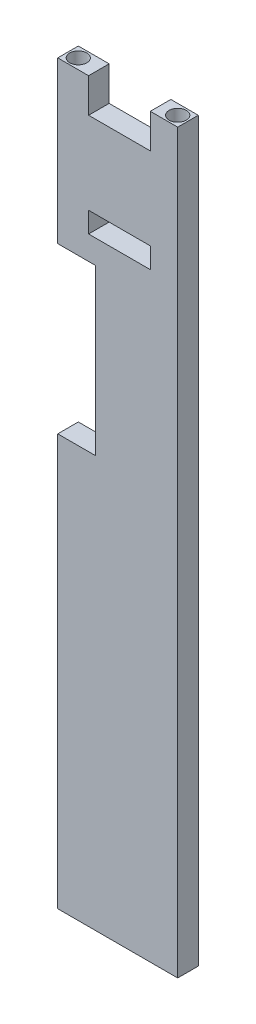
ISO-10303-21;
HEADER;
FILE_DESCRIPTION(('STEP AP214'),'2;1');
FILE_NAME('part.step','',(''),(''),'','','');
FILE_SCHEMA(('AUTOMOTIVE_DESIGN { 1 0 10303 214 1 1 1 1 }'));
ENDSEC;
DATA;
#1=APPLICATION_CONTEXT('core data for automotive mechanical design processes');
#2=APPLICATION_PROTOCOL_DEFINITION('international standard','automotive_design',2000,#1);
#3=PRODUCT_CONTEXT('',#1,'mechanical');
#4=PRODUCT('Part','Part','',(#3));
#5=PRODUCT_RELATED_PRODUCT_CATEGORY('part','',(#4));
#6=PRODUCT_DEFINITION_FORMATION('','',#4);
#7=PRODUCT_DEFINITION_CONTEXT('part definition',#1,'design');
#8=PRODUCT_DEFINITION('design','',#6,#7);
#9=PRODUCT_DEFINITION_SHAPE('','',#8);
#10=(LENGTH_UNIT() NAMED_UNIT(*) SI_UNIT(.MILLI.,.METRE.));
#11=(NAMED_UNIT(*) PLANE_ANGLE_UNIT() SI_UNIT($,.RADIAN.));
#12=(NAMED_UNIT(*) SI_UNIT($,.STERADIAN.) SOLID_ANGLE_UNIT());
#13=UNCERTAINTY_MEASURE_WITH_UNIT(LENGTH_MEASURE(1.E-05),#10,'distance_accuracy_value','');
#14=(GEOMETRIC_REPRESENTATION_CONTEXT(3) GLOBAL_UNCERTAINTY_ASSIGNED_CONTEXT((#13)) GLOBAL_UNIT_ASSIGNED_CONTEXT((#10,
#11,#12)) REPRESENTATION_CONTEXT('',''));
#15=CARTESIAN_POINT('',(0.,0.,0.));
#16=DIRECTION('',(0.,0.,1.));
#17=DIRECTION('',(1.,0.,0.));
#18=AXIS2_PLACEMENT_3D('',#15,#16,#17);
#19=CARTESIAN_POINT('',(0.,0.,6.));
#20=DIRECTION('',(1.,0.,0.));
#21=DIRECTION('',(0.,0.,-1.));
#22=AXIS2_PLACEMENT_3D('',#19,#20,#21);
#23=PLANE('',#22);
#24=DIRECTION('',(0.,-1.,0.));
#25=VECTOR('',#24,1.);
#26=CARTESIAN_POINT('',(0.,0.,6.));
#27=LINE('',#26,#25);
#28=CARTESIAN_POINT('',(5.90026326086193E-13,120.000003764364,6.));
#29=VERTEX_POINT('',#28);
#30=CARTESIAN_POINT('',(0.,0.,6.));
#31=VERTEX_POINT('',#30);
#32=EDGE_CURVE('E172',#29,#31,#27,.T.);
#33=ORIENTED_EDGE('',*,*,#32,.F.);
#34=DIRECTION('',(0.,0.,-1.));
#35=VECTOR('',#34,1.);
#36=CARTESIAN_POINT('',(5.90026326086193E-13,120.000003764364,6.));
#37=LINE('',#36,#35);
#38=CARTESIAN_POINT('',(5.90026326086193E-13,120.000003764364,0.));
#39=VERTEX_POINT('',#38);
#40=EDGE_CURVE('E232',#29,#39,#37,.T.);
#41=ORIENTED_EDGE('',*,*,#40,.T.);
#42=DIRECTION('',(0.,-1.,0.));
#43=VECTOR('',#42,1.);
#44=CARTESIAN_POINT('',(0.,0.,0.));
#45=LINE('',#44,#43);
#46=CARTESIAN_POINT('',(0.,0.,0.));
#47=VERTEX_POINT('',#46);
#48=EDGE_CURVE('E188',#39,#47,#45,.T.);
#49=ORIENTED_EDGE('',*,*,#48,.T.);
#50=DIRECTION('',(0.,0.,-1.));
#51=VECTOR('',#50,1.);
#52=CARTESIAN_POINT('',(0.,0.,6.));
#53=LINE('',#52,#51);
#54=EDGE_CURVE('E11',#31,#47,#53,.T.);
#55=ORIENTED_EDGE('',*,*,#54,.F.);
#56=EDGE_LOOP('',(#33,#41,#49,#55));
#57=FACE_BOUND('',#56,.T.);
#58=ADVANCED_FACE('F35',(#57),#23,.F.);
#59=CARTESIAN_POINT('',(0.,215.,6.));
#60=DIRECTION('',(0.,-1.,0.));
#61=DIRECTION('',(0.,0.,-1.));
#62=AXIS2_PLACEMENT_3D('',#59,#60,#61);
#63=PLANE('',#62);
#64=CARTESIAN_POINT('',(3.,215.,3.));
#65=DIRECTION('',(0.,1.,0.));
#66=DIRECTION('',(0.,0.,1.));
#67=AXIS2_PLACEMENT_3D('',#64,#65,#66);
#68=CIRCLE('',#67,2.5);
#69=CARTESIAN_POINT('',(3.,215.,5.5));
#70=VERTEX_POINT('',#69);
#71=EDGE_CURVE('E338',#70,#70,#68,.T.);
#72=ORIENTED_EDGE('',*,*,#71,.F.);
#73=EDGE_LOOP('',(#72));
#74=FACE_BOUND('',#73,.T.);
#75=DIRECTION('',(-1.,0.,0.));
#76=VECTOR('',#75,1.);
#77=CARTESIAN_POINT('',(0.,215.,6.));
#78=LINE('',#77,#76);
#79=CARTESIAN_POINT('',(9.,215.,6.));
#80=VERTEX_POINT('',#79);
#81=CARTESIAN_POINT('',(0.,215.,6.));
#82=VERTEX_POINT('',#81);
#83=EDGE_CURVE('E169',#80,#82,#78,.T.);
#84=ORIENTED_EDGE('',*,*,#83,.F.);
#85=DIRECTION('',(0.,0.,1.));
#86=VECTOR('',#85,1.);
#87=CARTESIAN_POINT('',(9.,215.,0.));
#88=LINE('',#87,#86);
#89=CARTESIAN_POINT('',(9.,215.,0.));
#90=VERTEX_POINT('',#89);
#91=EDGE_CURVE('E251',#90,#80,#88,.T.);
#92=ORIENTED_EDGE('',*,*,#91,.F.);
#93=DIRECTION('',(-1.,0.,0.));
#94=VECTOR('',#93,1.);
#95=CARTESIAN_POINT('',(0.,215.,0.));
#96=LINE('',#95,#94);
#97=CARTESIAN_POINT('',(0.,215.,0.));
#98=VERTEX_POINT('',#97);
#99=EDGE_CURVE('E192',#90,#98,#96,.T.);
#100=ORIENTED_EDGE('',*,*,#99,.T.);
#101=DIRECTION('',(0.,0.,-1.));
#102=VECTOR('',#101,1.);
#103=CARTESIAN_POINT('',(0.,215.,6.));
#104=LINE('',#103,#102);
#105=EDGE_CURVE('E185',#82,#98,#104,.T.);
#106=ORIENTED_EDGE('',*,*,#105,.F.);
#107=EDGE_LOOP('',(#84,#92,#100,#106));
#108=FACE_BOUND('',#107,.T.);
#109=ADVANCED_FACE('F282',(#74,#108),#63,.F.);
#110=CARTESIAN_POINT('',(0.,168.054649654043,0.));
#111=VERTEX_POINT('',#110);
#112=EDGE_CURVE('E163',#98,#111,#45,.T.);
#113=ORIENTED_EDGE('',*,*,#112,.T.);
#114=DIRECTION('',(0.,0.,-1.));
#115=VECTOR('',#114,1.);
#116=CARTESIAN_POINT('',(7.57808225454722E-13,168.054649654043,6.));
#117=LINE('',#116,#115);
#118=CARTESIAN_POINT('',(7.57808225454722E-13,168.054649654043,6.));
#119=VERTEX_POINT('',#118);
#120=EDGE_CURVE('E50',#119,#111,#117,.T.);
#121=ORIENTED_EDGE('',*,*,#120,.F.);
#122=EDGE_CURVE('E161',#82,#119,#27,.T.);
#123=ORIENTED_EDGE('',*,*,#122,.F.);
#124=ORIENTED_EDGE('',*,*,#105,.T.);
#125=EDGE_LOOP('',(#113,#121,#123,#124));
#126=FACE_BOUND('',#125,.T.);
#127=ADVANCED_FACE('F37',(#126),#23,.F.);
#128=CARTESIAN_POINT('',(0.,0.,6.));
#129=DIRECTION('',(0.,1.,0.));
#130=DIRECTION('',(0.,0.,1.));
#131=AXIS2_PLACEMENT_3D('',#128,#129,#130);
#132=PLANE('',#131);
#133=DIRECTION('',(1.,0.,0.));
#134=VECTOR('',#133,1.);
#135=CARTESIAN_POINT('',(0.,0.,0.));
#136=LINE('',#135,#134);
#137=CARTESIAN_POINT('',(35.,0.,0.));
#138=VERTEX_POINT('',#137);
#139=EDGE_CURVE('E187',#47,#138,#136,.T.);
#140=ORIENTED_EDGE('',*,*,#139,.T.);
#141=DIRECTION('',(0.,0.,-1.));
#142=VECTOR('',#141,1.);
#143=CARTESIAN_POINT('',(35.,0.,6.));
#144=LINE('',#143,#142);
#145=CARTESIAN_POINT('',(35.,0.,6.));
#146=VERTEX_POINT('',#145);
#147=EDGE_CURVE('E43',#146,#138,#144,.T.);
#148=ORIENTED_EDGE('',*,*,#147,.F.);
#149=DIRECTION('',(1.,0.,0.));
#150=VECTOR('',#149,1.);
#151=CARTESIAN_POINT('',(0.,0.,6.));
#152=LINE('',#151,#150);
#153=EDGE_CURVE('E171',#31,#146,#152,.T.);
#154=ORIENTED_EDGE('',*,*,#153,.F.);
#155=ORIENTED_EDGE('',*,*,#54,.T.);
#156=EDGE_LOOP('',(#140,#148,#154,#155));
#157=FACE_BOUND('',#156,.T.);
#158=ADVANCED_FACE('F229',(#157),#132,.F.);
#159=CARTESIAN_POINT('',(35.,0.,6.));
#160=DIRECTION('',(-1.,0.,0.));
#161=DIRECTION('',(0.,0.,1.));
#162=AXIS2_PLACEMENT_3D('',#159,#160,#161);
#163=PLANE('',#162);
#164=DIRECTION('',(0.,1.,0.));
#165=VECTOR('',#164,1.);
#166=CARTESIAN_POINT('',(35.,0.,0.));
#167=LINE('',#166,#165);
#168=CARTESIAN_POINT('',(35.,215.,0.));
#169=VERTEX_POINT('',#168);
#170=EDGE_CURVE('E190',#138,#169,#167,.T.);
#171=ORIENTED_EDGE('',*,*,#170,.T.);
#172=DIRECTION('',(0.,0.,-1.));
#173=VECTOR('',#172,1.);
#174=CARTESIAN_POINT('',(35.,215.,6.));
#175=LINE('',#174,#173);
#176=CARTESIAN_POINT('',(35.,215.,6.));
#177=VERTEX_POINT('',#176);
#178=EDGE_CURVE('E196',#177,#169,#175,.T.);
#179=ORIENTED_EDGE('',*,*,#178,.F.);
#180=DIRECTION('',(0.,1.,0.));
#181=VECTOR('',#180,1.);
#182=CARTESIAN_POINT('',(35.,0.,6.));
#183=LINE('',#182,#181);
#184=EDGE_CURVE('E174',#146,#177,#183,.T.);
#185=ORIENTED_EDGE('',*,*,#184,.F.);
#186=ORIENTED_EDGE('',*,*,#147,.T.);
#187=EDGE_LOOP('',(#171,#179,#185,#186));
#188=FACE_BOUND('',#187,.T.);
#189=ADVANCED_FACE('F203',(#188),#163,.F.);
#190=CARTESIAN_POINT('',(32.,215.,3.));
#191=DIRECTION('',(0.,1.,0.));
#192=DIRECTION('',(0.,0.,1.));
#193=AXIS2_PLACEMENT_3D('',#190,#191,#192);
#194=CIRCLE('',#193,2.5);
#195=CARTESIAN_POINT('',(32.,215.,5.5));
#196=VERTEX_POINT('',#195);
#197=EDGE_CURVE('E344',#196,#196,#194,.T.);
#198=ORIENTED_EDGE('',*,*,#197,.F.);
#199=EDGE_LOOP('',(#198));
#200=FACE_BOUND('',#199,.T.);
#201=CARTESIAN_POINT('',(27.,215.,0.));
#202=VERTEX_POINT('',#201);
#203=EDGE_CURVE('E176',#169,#202,#96,.T.);
#204=ORIENTED_EDGE('',*,*,#203,.T.);
#205=DIRECTION('',(0.,0.,-1.));
#206=VECTOR('',#205,1.);
#207=CARTESIAN_POINT('',(27.,215.,0.));
#208=LINE('',#207,#206);
#209=CARTESIAN_POINT('',(27.,215.,6.));
#210=VERTEX_POINT('',#209);
#211=EDGE_CURVE('E222',#210,#202,#208,.T.);
#212=ORIENTED_EDGE('',*,*,#211,.F.);
#213=EDGE_CURVE('E182',#177,#210,#78,.T.);
#214=ORIENTED_EDGE('',*,*,#213,.F.);
#215=ORIENTED_EDGE('',*,*,#178,.T.);
#216=EDGE_LOOP('',(#204,#212,#214,#215));
#217=FACE_BOUND('',#216,.T.);
#218=ADVANCED_FACE('F220',(#200,#217),#63,.F.);
#219=CARTESIAN_POINT('',(0.,0.,6.));
#220=DIRECTION('',(0.,0.,-1.));
#221=DIRECTION('',(-1.,0.,0.));
#222=AXIS2_PLACEMENT_3D('',#219,#220,#221);
#223=PLANE('',#222);
#224=DIRECTION('',(-1.,0.,0.));
#225=VECTOR('',#224,1.);
#226=CARTESIAN_POINT('',(27.,181.,6.));
#227=LINE('',#226,#225);
#228=CARTESIAN_POINT('',(27.,181.,6.));
#229=VERTEX_POINT('',#228);
#230=CARTESIAN_POINT('',(9.,181.,6.));
#231=VERTEX_POINT('',#230);
#232=EDGE_CURVE('E305',#229,#231,#227,.T.);
#233=ORIENTED_EDGE('',*,*,#232,.F.);
#234=DIRECTION('',(0.,1.,0.));
#235=VECTOR('',#234,1.);
#236=CARTESIAN_POINT('',(27.,175.,6.));
#237=LINE('',#236,#235);
#238=CARTESIAN_POINT('',(27.,175.,6.));
#239=VERTEX_POINT('',#238);
#240=EDGE_CURVE('E58',#239,#229,#237,.T.);
#241=ORIENTED_EDGE('',*,*,#240,.F.);
#242=DIRECTION('',(1.,0.,0.));
#243=VECTOR('',#242,1.);
#244=CARTESIAN_POINT('',(27.,175.,6.));
#245=LINE('',#244,#243);
#246=CARTESIAN_POINT('',(9.,175.,6.));
#247=VERTEX_POINT('',#246);
#248=EDGE_CURVE('E261',#247,#239,#245,.T.);
#249=ORIENTED_EDGE('',*,*,#248,.F.);
#250=DIRECTION('',(0.,-1.,0.));
#251=VECTOR('',#250,1.);
#252=CARTESIAN_POINT('',(9.,175.,6.));
#253=LINE('',#252,#251);
#254=EDGE_CURVE('E308',#231,#247,#253,.T.);
#255=ORIENTED_EDGE('',*,*,#254,.F.);
#256=EDGE_LOOP('',(#233,#241,#249,#255));
#257=FACE_BOUND('',#256,.T.);
#258=DIRECTION('',(0.,-1.,0.));
#259=VECTOR('',#258,1.);
#260=CARTESIAN_POINT('',(11.0000000000006,168.054649654043,6.));
#261=LINE('',#260,#259);
#262=CARTESIAN_POINT('',(11.0000000000006,168.054649654043,6.));
#263=VERTEX_POINT('',#262);
#264=CARTESIAN_POINT('',(11.0000000000006,120.000003764364,6.));
#265=VERTEX_POINT('',#264);
#266=EDGE_CURVE('E154',#263,#265,#261,.T.);
#267=ORIENTED_EDGE('',*,*,#266,.T.);
#268=DIRECTION('',(-1.,0.,0.));
#269=VECTOR('',#268,1.);
#270=CARTESIAN_POINT('',(5.90026326086193E-13,120.000003764364,6.));
#271=LINE('',#270,#269);
#272=EDGE_CURVE('E164',#265,#29,#271,.T.);
#273=ORIENTED_EDGE('',*,*,#272,.T.);
#274=ORIENTED_EDGE('',*,*,#32,.T.);
#275=ORIENTED_EDGE('',*,*,#153,.T.);
#276=ORIENTED_EDGE('',*,*,#184,.T.);
#277=ORIENTED_EDGE('',*,*,#213,.T.);
#278=DIRECTION('',(0.,1.,0.));
#279=VECTOR('',#278,1.);
#280=CARTESIAN_POINT('',(27.,205.,6.));
#281=LINE('',#280,#279);
#282=CARTESIAN_POINT('',(27.,205.,6.));
#283=VERTEX_POINT('',#282);
#284=EDGE_CURVE('E225',#283,#210,#281,.T.);
#285=ORIENTED_EDGE('',*,*,#284,.F.);
#286=DIRECTION('',(1.,0.,0.));
#287=VECTOR('',#286,1.);
#288=CARTESIAN_POINT('',(9.,205.,6.));
#289=LINE('',#288,#287);
#290=CARTESIAN_POINT('',(9.,205.,6.));
#291=VERTEX_POINT('',#290);
#292=EDGE_CURVE('E248',#291,#283,#289,.T.);
#293=ORIENTED_EDGE('',*,*,#292,.F.);
#294=DIRECTION('',(0.,1.,0.));
#295=VECTOR('',#294,1.);
#296=CARTESIAN_POINT('',(9.,205.,6.));
#297=LINE('',#296,#295);
#298=EDGE_CURVE('E178',#291,#80,#297,.T.);
#299=ORIENTED_EDGE('',*,*,#298,.T.);
#300=ORIENTED_EDGE('',*,*,#83,.T.);
#301=ORIENTED_EDGE('',*,*,#122,.T.);
#302=DIRECTION('',(1.,0.,0.));
#303=VECTOR('',#302,1.);
#304=CARTESIAN_POINT('',(7.57808225454722E-13,168.054649654043,6.));
#305=LINE('',#304,#303);
#306=EDGE_CURVE('E147',#119,#263,#305,.T.);
#307=ORIENTED_EDGE('',*,*,#306,.T.);
#308=EDGE_LOOP('',(#267,#273,#274,#275,#276,#277,#285,#293,#299,#300,#301,#307));
#309=FACE_BOUND('',#308,.T.);
#310=ADVANCED_FACE('F166',(#257,#309),#223,.F.);
#311=CARTESIAN_POINT('',(0.,0.,0.));
#312=DIRECTION('',(0.,0.,-1.));
#313=DIRECTION('',(-1.,0.,0.));
#314=AXIS2_PLACEMENT_3D('',#311,#312,#313);
#315=PLANE('',#314);
#316=DIRECTION('',(-1.,0.,0.));
#317=VECTOR('',#316,1.);
#318=CARTESIAN_POINT('',(5.90026326086193E-13,120.000003764364,0.));
#319=LINE('',#318,#317);
#320=CARTESIAN_POINT('',(11.0000000000006,120.000003764364,0.));
#321=VERTEX_POINT('',#320);
#322=EDGE_CURVE('E155',#321,#39,#319,.T.);
#323=ORIENTED_EDGE('',*,*,#322,.F.);
#324=DIRECTION('',(0.,-1.,0.));
#325=VECTOR('',#324,1.);
#326=CARTESIAN_POINT('',(11.0000000000006,168.054649654043,0.));
#327=LINE('',#326,#325);
#328=CARTESIAN_POINT('',(11.0000000000006,168.054649654043,0.));
#329=VERTEX_POINT('',#328);
#330=EDGE_CURVE('E330',#329,#321,#327,.T.);
#331=ORIENTED_EDGE('',*,*,#330,.F.);
#332=DIRECTION('',(1.,0.,0.));
#333=VECTOR('',#332,1.);
#334=CARTESIAN_POINT('',(7.57808225454722E-13,168.054649654043,0.));
#335=LINE('',#334,#333);
#336=EDGE_CURVE('E333',#111,#329,#335,.T.);
#337=ORIENTED_EDGE('',*,*,#336,.F.);
#338=ORIENTED_EDGE('',*,*,#112,.F.);
#339=ORIENTED_EDGE('',*,*,#99,.F.);
#340=DIRECTION('',(0.,1.,0.));
#341=VECTOR('',#340,1.);
#342=CARTESIAN_POINT('',(9.,205.,0.));
#343=LINE('',#342,#341);
#344=CARTESIAN_POINT('',(9.,205.,0.));
#345=VERTEX_POINT('',#344);
#346=EDGE_CURVE('E233',#345,#90,#343,.T.);
#347=ORIENTED_EDGE('',*,*,#346,.F.);
#348=DIRECTION('',(-1.,0.,0.));
#349=VECTOR('',#348,1.);
#350=CARTESIAN_POINT('',(9.,205.,0.));
#351=LINE('',#350,#349);
#352=CARTESIAN_POINT('',(27.,205.,0.));
#353=VERTEX_POINT('',#352);
#354=EDGE_CURVE('E242',#353,#345,#351,.T.);
#355=ORIENTED_EDGE('',*,*,#354,.F.);
#356=DIRECTION('',(0.,1.,0.));
#357=VECTOR('',#356,1.);
#358=CARTESIAN_POINT('',(27.,205.,0.));
#359=LINE('',#358,#357);
#360=EDGE_CURVE('E217',#353,#202,#359,.T.);
#361=ORIENTED_EDGE('',*,*,#360,.T.);
#362=ORIENTED_EDGE('',*,*,#203,.F.);
#363=ORIENTED_EDGE('',*,*,#170,.F.);
#364=ORIENTED_EDGE('',*,*,#139,.F.);
#365=ORIENTED_EDGE('',*,*,#48,.F.);
#366=EDGE_LOOP('',(#323,#331,#337,#338,#339,#347,#355,#361,#362,#363,#364,#365));
#367=FACE_BOUND('',#366,.T.);
#368=DIRECTION('',(0.,1.,0.));
#369=VECTOR('',#368,1.);
#370=CARTESIAN_POINT('',(27.,175.,0.));
#371=LINE('',#370,#369);
#372=CARTESIAN_POINT('',(27.,175.,0.));
#373=VERTEX_POINT('',#372);
#374=CARTESIAN_POINT('',(27.,181.,0.));
#375=VERTEX_POINT('',#374);
#376=EDGE_CURVE('E322',#373,#375,#371,.T.);
#377=ORIENTED_EDGE('',*,*,#376,.T.);
#378=DIRECTION('',(-1.,0.,0.));
#379=VECTOR('',#378,1.);
#380=CARTESIAN_POINT('',(27.,181.,0.));
#381=LINE('',#380,#379);
#382=CARTESIAN_POINT('',(9.,181.,0.));
#383=VERTEX_POINT('',#382);
#384=EDGE_CURVE('E319',#375,#383,#381,.T.);
#385=ORIENTED_EDGE('',*,*,#384,.T.);
#386=DIRECTION('',(0.,-1.,0.));
#387=VECTOR('',#386,1.);
#388=CARTESIAN_POINT('',(9.,175.,0.));
#389=LINE('',#388,#387);
#390=CARTESIAN_POINT('',(9.,175.,0.));
#391=VERTEX_POINT('',#390);
#392=EDGE_CURVE('E316',#383,#391,#389,.T.);
#393=ORIENTED_EDGE('',*,*,#392,.T.);
#394=DIRECTION('',(1.,0.,0.));
#395=VECTOR('',#394,1.);
#396=CARTESIAN_POINT('',(27.,175.,0.));
#397=LINE('',#396,#395);
#398=EDGE_CURVE('E267',#391,#373,#397,.T.);
#399=ORIENTED_EDGE('',*,*,#398,.T.);
#400=EDGE_LOOP('',(#377,#385,#393,#399));
#401=FACE_BOUND('',#400,.T.);
#402=ADVANCED_FACE('F211',(#367,#401),#315,.T.);
#403=CARTESIAN_POINT('',(9.,205.,0.));
#404=DIRECTION('',(-1.,0.,0.));
#405=DIRECTION('',(0.,0.,1.));
#406=AXIS2_PLACEMENT_3D('',#403,#404,#405);
#407=PLANE('',#406);
#408=ORIENTED_EDGE('',*,*,#91,.T.);
#409=ORIENTED_EDGE('',*,*,#298,.F.);
#410=DIRECTION('',(0.,0.,1.));
#411=VECTOR('',#410,1.);
#412=CARTESIAN_POINT('',(9.,205.,0.));
#413=LINE('',#412,#411);
#414=EDGE_CURVE('E253',#345,#291,#413,.T.);
#415=ORIENTED_EDGE('',*,*,#414,.F.);
#416=ORIENTED_EDGE('',*,*,#346,.T.);
#417=EDGE_LOOP('',(#408,#409,#415,#416));
#418=FACE_BOUND('',#417,.T.);
#419=ADVANCED_FACE('F270',(#418),#407,.F.);
#420=CARTESIAN_POINT('',(27.,205.,0.));
#421=DIRECTION('',(1.,0.,0.));
#422=DIRECTION('',(0.,0.,-1.));
#423=AXIS2_PLACEMENT_3D('',#420,#421,#422);
#424=PLANE('',#423);
#425=ORIENTED_EDGE('',*,*,#211,.T.);
#426=ORIENTED_EDGE('',*,*,#360,.F.);
#427=DIRECTION('',(0.,0.,-1.));
#428=VECTOR('',#427,1.);
#429=CARTESIAN_POINT('',(27.,205.,0.));
#430=LINE('',#429,#428);
#431=EDGE_CURVE('E244',#283,#353,#430,.T.);
#432=ORIENTED_EDGE('',*,*,#431,.F.);
#433=ORIENTED_EDGE('',*,*,#284,.T.);
#434=EDGE_LOOP('',(#425,#426,#432,#433));
#435=FACE_BOUND('',#434,.T.);
#436=ADVANCED_FACE('F272',(#435),#424,.F.);
#437=CARTESIAN_POINT('',(0.,205.,0.));
#438=DIRECTION('',(0.,1.,0.));
#439=DIRECTION('',(0.,0.,1.));
#440=AXIS2_PLACEMENT_3D('',#437,#438,#439);
#441=PLANE('',#440);
#442=ORIENTED_EDGE('',*,*,#414,.T.);
#443=ORIENTED_EDGE('',*,*,#292,.T.);
#444=ORIENTED_EDGE('',*,*,#431,.T.);
#445=ORIENTED_EDGE('',*,*,#354,.T.);
#446=EDGE_LOOP('',(#442,#443,#444,#445));
#447=FACE_BOUND('',#446,.T.);
#448=ADVANCED_FACE('F269',(#447),#441,.T.);
#449=CARTESIAN_POINT('',(27.,175.,0.));
#450=DIRECTION('',(1.,0.,0.));
#451=DIRECTION('',(0.,0.,-1.));
#452=AXIS2_PLACEMENT_3D('',#449,#450,#451);
#453=PLANE('',#452);
#454=ORIENTED_EDGE('',*,*,#240,.T.);
#455=DIRECTION('',(0.,0.,1.));
#456=VECTOR('',#455,1.);
#457=CARTESIAN_POINT('',(27.,181.,0.));
#458=LINE('',#457,#456);
#459=EDGE_CURVE('E265',#375,#229,#458,.T.);
#460=ORIENTED_EDGE('',*,*,#459,.F.);
#461=ORIENTED_EDGE('',*,*,#376,.F.);
#462=DIRECTION('',(0.,0.,1.));
#463=VECTOR('',#462,1.);
#464=CARTESIAN_POINT('',(27.,175.,0.));
#465=LINE('',#464,#463);
#466=EDGE_CURVE('E252',#373,#239,#465,.T.);
#467=ORIENTED_EDGE('',*,*,#466,.T.);
#468=EDGE_LOOP('',(#454,#460,#461,#467));
#469=FACE_BOUND('',#468,.T.);
#470=ADVANCED_FACE('F385',(#469),#453,.F.);
#471=CARTESIAN_POINT('',(27.,175.,0.));
#472=DIRECTION('',(0.,-1.,0.));
#473=DIRECTION('',(0.,0.,-1.));
#474=AXIS2_PLACEMENT_3D('',#471,#472,#473);
#475=PLANE('',#474);
#476=ORIENTED_EDGE('',*,*,#248,.T.);
#477=ORIENTED_EDGE('',*,*,#466,.F.);
#478=ORIENTED_EDGE('',*,*,#398,.F.);
#479=DIRECTION('',(0.,0.,1.));
#480=VECTOR('',#479,1.);
#481=CARTESIAN_POINT('',(9.,175.,0.));
#482=LINE('',#481,#480);
#483=EDGE_CURVE('E254',#391,#247,#482,.T.);
#484=ORIENTED_EDGE('',*,*,#483,.T.);
#485=EDGE_LOOP('',(#476,#477,#478,#484));
#486=FACE_BOUND('',#485,.T.);
#487=ADVANCED_FACE('F381',(#486),#475,.F.);
#488=CARTESIAN_POINT('',(9.,175.,0.));
#489=DIRECTION('',(-1.,0.,0.));
#490=DIRECTION('',(0.,0.,1.));
#491=AXIS2_PLACEMENT_3D('',#488,#489,#490);
#492=PLANE('',#491);
#493=ORIENTED_EDGE('',*,*,#254,.T.);
#494=ORIENTED_EDGE('',*,*,#483,.F.);
#495=ORIENTED_EDGE('',*,*,#392,.F.);
#496=DIRECTION('',(0.,0.,1.));
#497=VECTOR('',#496,1.);
#498=CARTESIAN_POINT('',(9.,181.,0.));
#499=LINE('',#498,#497);
#500=EDGE_CURVE('E258',#383,#231,#499,.T.);
#501=ORIENTED_EDGE('',*,*,#500,.T.);
#502=EDGE_LOOP('',(#493,#494,#495,#501));
#503=FACE_BOUND('',#502,.T.);
#504=ADVANCED_FACE('F384',(#503),#492,.F.);
#505=CARTESIAN_POINT('',(27.,181.,0.));
#506=DIRECTION('',(0.,1.,0.));
#507=DIRECTION('',(0.,0.,1.));
#508=AXIS2_PLACEMENT_3D('',#505,#506,#507);
#509=PLANE('',#508);
#510=ORIENTED_EDGE('',*,*,#232,.T.);
#511=ORIENTED_EDGE('',*,*,#500,.F.);
#512=ORIENTED_EDGE('',*,*,#384,.F.);
#513=ORIENTED_EDGE('',*,*,#459,.T.);
#514=EDGE_LOOP('',(#510,#511,#512,#513));
#515=FACE_BOUND('',#514,.T.);
#516=ADVANCED_FACE('F374',(#515),#509,.F.);
#517=CARTESIAN_POINT('',(5.90026326086193E-13,120.000003764364,6.));
#518=DIRECTION('',(0.,-1.,0.));
#519=DIRECTION('',(0.,0.,-1.));
#520=AXIS2_PLACEMENT_3D('',#517,#518,#519);
#521=PLANE('',#520);
#522=ORIENTED_EDGE('',*,*,#322,.T.);
#523=ORIENTED_EDGE('',*,*,#40,.F.);
#524=ORIENTED_EDGE('',*,*,#272,.F.);
#525=DIRECTION('',(0.,0.,-1.));
#526=VECTOR('',#525,1.);
#527=CARTESIAN_POINT('',(11.0000000000006,120.000003764364,6.));
#528=LINE('',#527,#526);
#529=EDGE_CURVE('E326',#265,#321,#528,.T.);
#530=ORIENTED_EDGE('',*,*,#529,.T.);
#531=EDGE_LOOP('',(#522,#523,#524,#530));
#532=FACE_BOUND('',#531,.T.);
#533=ADVANCED_FACE('F370',(#532),#521,.F.);
#534=CARTESIAN_POINT('',(11.0000000000006,168.054649654043,6.));
#535=DIRECTION('',(1.,0.,0.));
#536=DIRECTION('',(0.,1.,0.));
#537=AXIS2_PLACEMENT_3D('',#534,#535,#536);
#538=PLANE('',#537);
#539=ORIENTED_EDGE('',*,*,#330,.T.);
#540=ORIENTED_EDGE('',*,*,#529,.F.);
#541=ORIENTED_EDGE('',*,*,#266,.F.);
#542=DIRECTION('',(0.,0.,-1.));
#543=VECTOR('',#542,1.);
#544=CARTESIAN_POINT('',(11.0000000000006,168.054649654043,6.));
#545=LINE('',#544,#543);
#546=EDGE_CURVE('E149',#263,#329,#545,.T.);
#547=ORIENTED_EDGE('',*,*,#546,.T.);
#548=EDGE_LOOP('',(#539,#540,#541,#547));
#549=FACE_BOUND('',#548,.T.);
#550=ADVANCED_FACE('F373',(#549),#538,.F.);
#551=CARTESIAN_POINT('',(7.57808225454722E-13,168.054649654043,6.));
#552=DIRECTION('',(0.,1.,0.));
#553=DIRECTION('',(0.,0.,1.));
#554=AXIS2_PLACEMENT_3D('',#551,#552,#553);
#555=PLANE('',#554);
#556=ORIENTED_EDGE('',*,*,#336,.T.);
#557=ORIENTED_EDGE('',*,*,#546,.F.);
#558=ORIENTED_EDGE('',*,*,#306,.F.);
#559=ORIENTED_EDGE('',*,*,#120,.T.);
#560=EDGE_LOOP('',(#556,#557,#558,#559));
#561=FACE_BOUND('',#560,.T.);
#562=ADVANCED_FACE('F148',(#561),#555,.F.);
#563=CARTESIAN_POINT('',(3.,205.,3.));
#564=DIRECTION('',(0.,1.,0.));
#565=DIRECTION('',(0.,0.,1.));
#566=AXIS2_PLACEMENT_3D('',#563,#564,#565);
#567=CYLINDRICAL_SURFACE('',#566,2.5);
#568=CARTESIAN_POINT('',(3.,205.,3.));
#569=DIRECTION('',(0.,1.,0.));
#570=DIRECTION('',(0.,0.,1.));
#571=AXIS2_PLACEMENT_3D('',#568,#569,#570);
#572=CIRCLE('',#571,2.5);
#573=CARTESIAN_POINT('',(3.,205.,5.5));
#574=VERTEX_POINT('',#573);
#575=EDGE_CURVE('E335',#574,#574,#572,.T.);
#576=ORIENTED_EDGE('',*,*,#575,.F.);
#577=EDGE_LOOP('',(#576));
#578=FACE_BOUND('',#577,.T.);
#579=ORIENTED_EDGE('',*,*,#71,.T.);
#580=EDGE_LOOP('',(#579));
#581=FACE_BOUND('',#580,.T.);
#582=ADVANCED_FACE('F363',(#578,#581),#567,.F.);
#583=CARTESIAN_POINT('',(3.,205.,3.));
#584=DIRECTION('',(0.,1.,0.));
#585=DIRECTION('',(0.,0.,1.));
#586=AXIS2_PLACEMENT_3D('',#583,#584,#585);
#587=PLANE('',#586);
#588=ORIENTED_EDGE('',*,*,#575,.T.);
#589=EDGE_LOOP('',(#588));
#590=FACE_BOUND('',#589,.T.);
#591=ADVANCED_FACE('F355',(#590),#587,.T.);
#592=CARTESIAN_POINT('',(32.,205.,3.));
#593=DIRECTION('',(0.,1.,0.));
#594=DIRECTION('',(0.,0.,1.));
#595=AXIS2_PLACEMENT_3D('',#592,#593,#594);
#596=CYLINDRICAL_SURFACE('',#595,2.5);
#597=CARTESIAN_POINT('',(32.,205.,3.));
#598=DIRECTION('',(0.,1.,0.));
#599=DIRECTION('',(0.,0.,1.));
#600=AXIS2_PLACEMENT_3D('',#597,#598,#599);
#601=CIRCLE('',#600,2.5);
#602=CARTESIAN_POINT('',(32.,205.,5.5));
#603=VERTEX_POINT('',#602);
#604=EDGE_CURVE('E341',#603,#603,#601,.T.);
#605=ORIENTED_EDGE('',*,*,#604,.F.);
#606=EDGE_LOOP('',(#605));
#607=FACE_BOUND('',#606,.T.);
#608=ORIENTED_EDGE('',*,*,#197,.T.);
#609=EDGE_LOOP('',(#608));
#610=FACE_BOUND('',#609,.T.);
#611=ADVANCED_FACE('F352',(#607,#610),#596,.F.);
#612=CARTESIAN_POINT('',(32.,205.,3.));
#613=DIRECTION('',(0.,1.,0.));
#614=DIRECTION('',(0.,0.,1.));
#615=AXIS2_PLACEMENT_3D('',#612,#613,#614);
#616=PLANE('',#615);
#617=ORIENTED_EDGE('',*,*,#604,.T.);
#618=EDGE_LOOP('',(#617));
#619=FACE_BOUND('',#618,.T.);
#620=ADVANCED_FACE('F350',(#619),#616,.T.);
#621=CLOSED_SHELL('',(#58,#109,#127,#158,#189,#218,#310,#402,#419,#436,#448,#470,#487,#504,#516,
#533,#550,#562,#582,#591,#611,#620));
#622=MANIFOLD_SOLID_BREP('B2',#621);
#623=ADVANCED_BREP_SHAPE_REPRESENTATION('',(#18,#622),#14);
#624=SHAPE_DEFINITION_REPRESENTATION(#9,#623);
ENDSEC;
END-ISO-10303-21;
